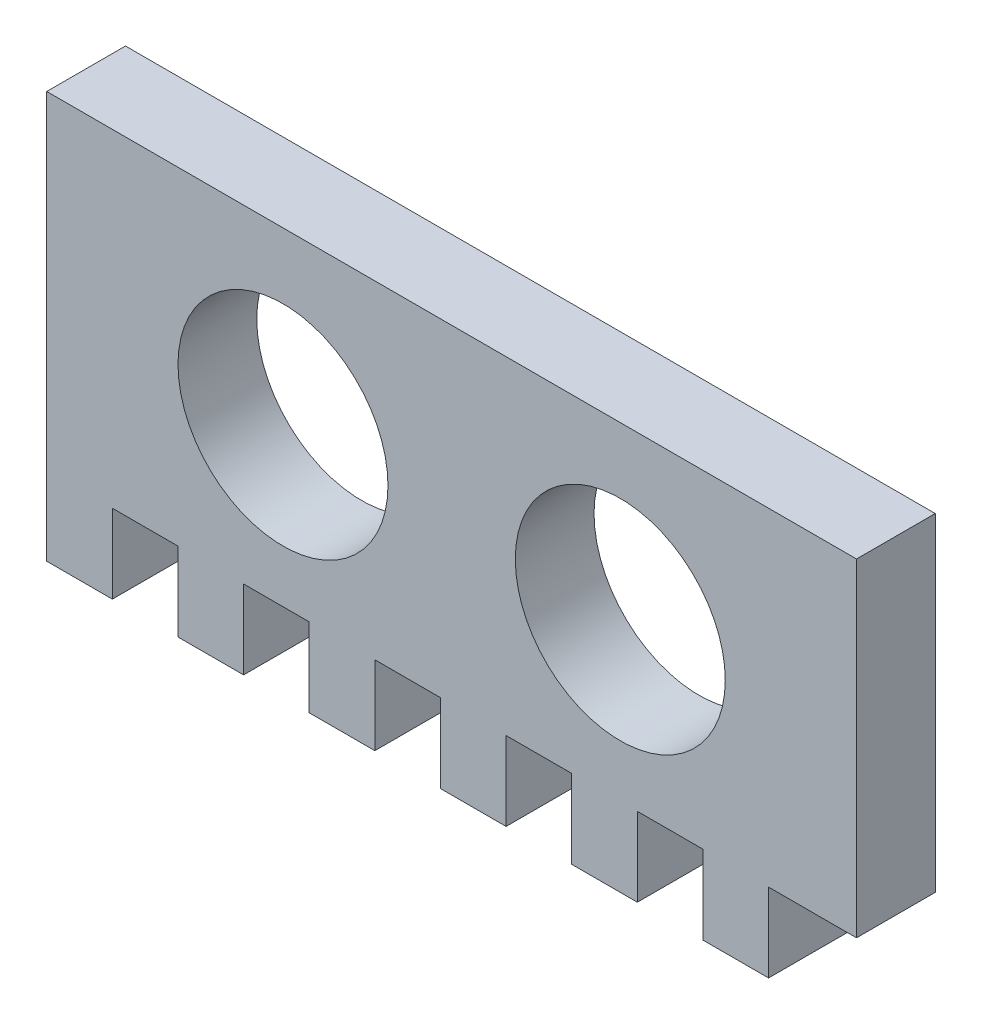
ISO-10303-21;
HEADER;
FILE_DESCRIPTION(('STEP AP214'),'2;1');
FILE_NAME('part.step','',(''),(''),'','','');
FILE_SCHEMA(('AUTOMOTIVE_DESIGN { 1 0 10303 214 1 1 1 1 }'));
ENDSEC;
DATA;
#1=APPLICATION_CONTEXT('core data for automotive mechanical design processes');
#2=APPLICATION_PROTOCOL_DEFINITION('international standard','automotive_design',2000,#1);
#3=PRODUCT_CONTEXT('',#1,'mechanical');
#4=PRODUCT('Part','Part','',(#3));
#5=PRODUCT_RELATED_PRODUCT_CATEGORY('part','',(#4));
#6=PRODUCT_DEFINITION_FORMATION('','',#4);
#7=PRODUCT_DEFINITION_CONTEXT('part definition',#1,'design');
#8=PRODUCT_DEFINITION('design','',#6,#7);
#9=PRODUCT_DEFINITION_SHAPE('','',#8);
#10=(LENGTH_UNIT() NAMED_UNIT(*) SI_UNIT(.MILLI.,.METRE.));
#11=(NAMED_UNIT(*) PLANE_ANGLE_UNIT() SI_UNIT($,.RADIAN.));
#12=(NAMED_UNIT(*) SI_UNIT($,.STERADIAN.) SOLID_ANGLE_UNIT());
#13=UNCERTAINTY_MEASURE_WITH_UNIT(LENGTH_MEASURE(1.E-05),#10,'distance_accuracy_value','');
#14=(GEOMETRIC_REPRESENTATION_CONTEXT(3) GLOBAL_UNCERTAINTY_ASSIGNED_CONTEXT((#13)) GLOBAL_UNIT_ASSIGNED_CONTEXT((#10,
#11,#12)) REPRESENTATION_CONTEXT('',''));
#15=CARTESIAN_POINT('',(0.,0.,0.));
#16=DIRECTION('',(0.,0.,1.));
#17=DIRECTION('',(1.,0.,0.));
#18=AXIS2_PLACEMENT_3D('',#15,#16,#17);
#19=CARTESIAN_POINT('',(0.,0.,6.));
#20=DIRECTION('',(0.,0.,1.));
#21=DIRECTION('',(1.,0.,0.));
#22=AXIS2_PLACEMENT_3D('',#19,#20,#21);
#23=PLANE('',#22);
#24=CARTESIAN_POINT('',(18.,18.,6.));
#25=DIRECTION('',(0.,0.,1.));
#26=DIRECTION('',(1.,0.,0.));
#27=AXIS2_PLACEMENT_3D('',#24,#25,#26);
#28=CIRCLE('',#27,8.);
#29=CARTESIAN_POINT('',(26.,18.,6.));
#30=VERTEX_POINT('',#29);
#31=EDGE_CURVE('E374',#30,#30,#28,.T.);
#32=ORIENTED_EDGE('',*,*,#31,.F.);
#33=EDGE_LOOP('',(#32));
#34=FACE_BOUND('',#33,.T.);
#35=DIRECTION('',(1.,0.,0.));
#36=VECTOR('',#35,1.);
#37=CARTESIAN_POINT('',(0.,0.,6.));
#38=LINE('',#37,#36);
#39=CARTESIAN_POINT('',(0.,0.,6.));
#40=VERTEX_POINT('',#39);
#41=CARTESIAN_POINT('',(5.,0.,6.));
#42=VERTEX_POINT('',#41);
#43=EDGE_CURVE('E367',#40,#42,#38,.T.);
#44=ORIENTED_EDGE('',*,*,#43,.T.);
#45=DIRECTION('',(0.,1.,0.));
#46=VECTOR('',#45,1.);
#47=CARTESIAN_POINT('',(5.,0.,6.));
#48=LINE('',#47,#46);
#49=CARTESIAN_POINT('',(5.,6.,6.));
#50=VERTEX_POINT('',#49);
#51=EDGE_CURVE('E161',#42,#50,#48,.T.);
#52=ORIENTED_EDGE('',*,*,#51,.T.);
#53=DIRECTION('',(1.,0.,0.));
#54=VECTOR('',#53,1.);
#55=CARTESIAN_POINT('',(5.,6.,6.));
#56=LINE('',#55,#54);
#57=CARTESIAN_POINT('',(10.,6.,6.));
#58=VERTEX_POINT('',#57);
#59=EDGE_CURVE('E361',#50,#58,#56,.T.);
#60=ORIENTED_EDGE('',*,*,#59,.T.);
#61=DIRECTION('',(0.,-1.,0.));
#62=VECTOR('',#61,1.);
#63=CARTESIAN_POINT('',(10.,6.,6.));
#64=LINE('',#63,#62);
#65=CARTESIAN_POINT('',(10.,0.,6.));
#66=VERTEX_POINT('',#65);
#67=EDGE_CURVE('E353',#58,#66,#64,.T.);
#68=ORIENTED_EDGE('',*,*,#67,.T.);
#69=DIRECTION('',(1.,0.,0.));
#70=VECTOR('',#69,1.);
#71=CARTESIAN_POINT('',(10.,0.,6.));
#72=LINE('',#71,#70);
#73=CARTESIAN_POINT('',(15.,0.,6.));
#74=VERTEX_POINT('',#73);
#75=EDGE_CURVE('E349',#66,#74,#72,.T.);
#76=ORIENTED_EDGE('',*,*,#75,.T.);
#77=DIRECTION('',(0.,1.,0.));
#78=VECTOR('',#77,1.);
#79=CARTESIAN_POINT('',(15.,0.,6.));
#80=LINE('',#79,#78);
#81=CARTESIAN_POINT('',(15.,6.,6.));
#82=VERTEX_POINT('',#81);
#83=EDGE_CURVE('E345',#74,#82,#80,.T.);
#84=ORIENTED_EDGE('',*,*,#83,.T.);
#85=DIRECTION('',(1.,0.,0.));
#86=VECTOR('',#85,1.);
#87=CARTESIAN_POINT('',(15.,6.,6.));
#88=LINE('',#87,#86);
#89=CARTESIAN_POINT('',(20.,6.,6.));
#90=VERTEX_POINT('',#89);
#91=EDGE_CURVE('E342',#82,#90,#88,.T.);
#92=ORIENTED_EDGE('',*,*,#91,.T.);
#93=DIRECTION('',(0.,-1.,0.));
#94=VECTOR('',#93,1.);
#95=CARTESIAN_POINT('',(20.,6.,6.));
#96=LINE('',#95,#94);
#97=CARTESIAN_POINT('',(20.,0.,6.));
#98=VERTEX_POINT('',#97);
#99=EDGE_CURVE('E334',#90,#98,#96,.T.);
#100=ORIENTED_EDGE('',*,*,#99,.T.);
#101=DIRECTION('',(1.,0.,0.));
#102=VECTOR('',#101,1.);
#103=CARTESIAN_POINT('',(20.,0.,6.));
#104=LINE('',#103,#102);
#105=CARTESIAN_POINT('',(25.,0.,6.));
#106=VERTEX_POINT('',#105);
#107=EDGE_CURVE('E330',#98,#106,#104,.T.);
#108=ORIENTED_EDGE('',*,*,#107,.T.);
#109=DIRECTION('',(0.,1.,0.));
#110=VECTOR('',#109,1.);
#111=CARTESIAN_POINT('',(25.,0.,6.));
#112=LINE('',#111,#110);
#113=CARTESIAN_POINT('',(25.,6.,6.));
#114=VERTEX_POINT('',#113);
#115=EDGE_CURVE('E326',#106,#114,#112,.T.);
#116=ORIENTED_EDGE('',*,*,#115,.T.);
#117=DIRECTION('',(1.,0.,0.));
#118=VECTOR('',#117,1.);
#119=CARTESIAN_POINT('',(25.,6.,6.));
#120=LINE('',#119,#118);
#121=CARTESIAN_POINT('',(30.,6.,6.));
#122=VERTEX_POINT('',#121);
#123=EDGE_CURVE('E323',#114,#122,#120,.T.);
#124=ORIENTED_EDGE('',*,*,#123,.T.);
#125=DIRECTION('',(0.,-1.,0.));
#126=VECTOR('',#125,1.);
#127=CARTESIAN_POINT('',(30.,6.,6.));
#128=LINE('',#127,#126);
#129=CARTESIAN_POINT('',(30.,0.,6.));
#130=VERTEX_POINT('',#129);
#131=EDGE_CURVE('E315',#122,#130,#128,.T.);
#132=ORIENTED_EDGE('',*,*,#131,.T.);
#133=DIRECTION('',(1.,0.,0.));
#134=VECTOR('',#133,1.);
#135=CARTESIAN_POINT('',(30.,0.,6.));
#136=LINE('',#135,#134);
#137=CARTESIAN_POINT('',(35.,0.,6.));
#138=VERTEX_POINT('',#137);
#139=EDGE_CURVE('E311',#130,#138,#136,.T.);
#140=ORIENTED_EDGE('',*,*,#139,.T.);
#141=DIRECTION('',(0.,1.,0.));
#142=VECTOR('',#141,1.);
#143=CARTESIAN_POINT('',(35.,0.,6.));
#144=LINE('',#143,#142);
#145=CARTESIAN_POINT('',(35.,6.,6.));
#146=VERTEX_POINT('',#145);
#147=EDGE_CURVE('E307',#138,#146,#144,.T.);
#148=ORIENTED_EDGE('',*,*,#147,.T.);
#149=DIRECTION('',(1.,0.,0.));
#150=VECTOR('',#149,1.);
#151=CARTESIAN_POINT('',(35.,6.,6.));
#152=LINE('',#151,#150);
#153=CARTESIAN_POINT('',(40.,6.,6.));
#154=VERTEX_POINT('',#153);
#155=EDGE_CURVE('E304',#146,#154,#152,.T.);
#156=ORIENTED_EDGE('',*,*,#155,.T.);
#157=DIRECTION('',(0.,-1.,0.));
#158=VECTOR('',#157,1.);
#159=CARTESIAN_POINT('',(40.,6.,6.));
#160=LINE('',#159,#158);
#161=CARTESIAN_POINT('',(40.,0.,6.));
#162=VERTEX_POINT('',#161);
#163=EDGE_CURVE('E296',#154,#162,#160,.T.);
#164=ORIENTED_EDGE('',*,*,#163,.T.);
#165=DIRECTION('',(1.,0.,0.));
#166=VECTOR('',#165,1.);
#167=CARTESIAN_POINT('',(40.,0.,6.));
#168=LINE('',#167,#166);
#169=CARTESIAN_POINT('',(45.,0.,6.));
#170=VERTEX_POINT('',#169);
#171=EDGE_CURVE('E292',#162,#170,#168,.T.);
#172=ORIENTED_EDGE('',*,*,#171,.T.);
#173=DIRECTION('',(0.,1.,0.));
#174=VECTOR('',#173,1.);
#175=CARTESIAN_POINT('',(45.,0.,6.));
#176=LINE('',#175,#174);
#177=CARTESIAN_POINT('',(45.,6.,6.));
#178=VERTEX_POINT('',#177);
#179=EDGE_CURVE('E288',#170,#178,#176,.T.);
#180=ORIENTED_EDGE('',*,*,#179,.T.);
#181=DIRECTION('',(1.,0.,0.));
#182=VECTOR('',#181,1.);
#183=CARTESIAN_POINT('',(45.,6.,6.));
#184=LINE('',#183,#182);
#185=CARTESIAN_POINT('',(50.,6.,6.));
#186=VERTEX_POINT('',#185);
#187=EDGE_CURVE('E285',#178,#186,#184,.T.);
#188=ORIENTED_EDGE('',*,*,#187,.T.);
#189=DIRECTION('',(0.,-1.,0.));
#190=VECTOR('',#189,1.);
#191=CARTESIAN_POINT('',(50.,6.,6.));
#192=LINE('',#191,#190);
#193=CARTESIAN_POINT('',(50.,0.,6.));
#194=VERTEX_POINT('',#193);
#195=EDGE_CURVE('E277',#186,#194,#192,.T.);
#196=ORIENTED_EDGE('',*,*,#195,.T.);
#197=DIRECTION('',(1.,0.,0.));
#198=VECTOR('',#197,1.);
#199=CARTESIAN_POINT('',(50.,0.,6.));
#200=LINE('',#199,#198);
#201=CARTESIAN_POINT('',(55.,0.,6.));
#202=VERTEX_POINT('',#201);
#203=EDGE_CURVE('E273',#194,#202,#200,.T.);
#204=ORIENTED_EDGE('',*,*,#203,.T.);
#205=DIRECTION('',(0.,1.,0.));
#206=VECTOR('',#205,1.);
#207=CARTESIAN_POINT('',(55.,0.,6.));
#208=LINE('',#207,#206);
#209=CARTESIAN_POINT('',(55.,6.,6.));
#210=VERTEX_POINT('',#209);
#211=EDGE_CURVE('E269',#202,#210,#208,.T.);
#212=ORIENTED_EDGE('',*,*,#211,.T.);
#213=DIRECTION('',(1.,0.,0.));
#214=VECTOR('',#213,1.);
#215=CARTESIAN_POINT('',(55.,6.,6.));
#216=LINE('',#215,#214);
#217=CARTESIAN_POINT('',(61.7,6.,6.));
#218=VERTEX_POINT('',#217);
#219=EDGE_CURVE('E234',#210,#218,#216,.T.);
#220=ORIENTED_EDGE('',*,*,#219,.T.);
#221=DIRECTION('',(0.,1.,0.));
#222=VECTOR('',#221,1.);
#223=CARTESIAN_POINT('',(61.7,31.,6.));
#224=LINE('',#223,#222);
#225=CARTESIAN_POINT('',(61.7,31.,6.));
#226=VERTEX_POINT('',#225);
#227=EDGE_CURVE('E228',#218,#226,#224,.T.);
#228=ORIENTED_EDGE('',*,*,#227,.T.);
#229=DIRECTION('',(-1.,0.,0.));
#230=VECTOR('',#229,1.);
#231=CARTESIAN_POINT('',(0.,31.,6.));
#232=LINE('',#231,#230);
#233=CARTESIAN_POINT('',(0.,31.,6.));
#234=VERTEX_POINT('',#233);
#235=EDGE_CURVE('E232',#226,#234,#232,.T.);
#236=ORIENTED_EDGE('',*,*,#235,.T.);
#237=DIRECTION('',(0.,-1.,0.));
#238=VECTOR('',#237,1.);
#239=CARTESIAN_POINT('',(0.,0.,6.));
#240=LINE('',#239,#238);
#241=EDGE_CURVE('E64',#234,#40,#240,.T.);
#242=ORIENTED_EDGE('',*,*,#241,.T.);
#243=EDGE_LOOP('',(#44,#52,#60,#68,#76,#84,#92,#100,#108,#116,#124,#132,#140,#148,#156,#164,
#172,#180,#188,#196,#204,#212,#220,#228,#236,#242));
#244=FACE_BOUND('',#243,.T.);
#245=CARTESIAN_POINT('',(43.7,18.,6.));
#246=DIRECTION('',(0.,0.,1.));
#247=DIRECTION('',(1.,0.,0.));
#248=AXIS2_PLACEMENT_3D('',#245,#246,#247);
#249=CIRCLE('',#248,8.);
#250=CARTESIAN_POINT('',(51.7,18.,6.));
#251=VERTEX_POINT('',#250);
#252=EDGE_CURVE('E383',#251,#251,#249,.T.);
#253=ORIENTED_EDGE('',*,*,#252,.F.);
#254=EDGE_LOOP('',(#253));
#255=FACE_BOUND('',#254,.T.);
#256=ADVANCED_FACE('F46',(#34,#244,#255),#23,.T.);
#257=CARTESIAN_POINT('',(0.,0.,0.));
#258=DIRECTION('',(0.,0.,1.));
#259=DIRECTION('',(1.,0.,0.));
#260=AXIS2_PLACEMENT_3D('',#257,#258,#259);
#261=PLANE('',#260);
#262=DIRECTION('',(1.,0.,0.));
#263=VECTOR('',#262,1.);
#264=CARTESIAN_POINT('',(0.,0.,0.));
#265=LINE('',#264,#263);
#266=CARTESIAN_POINT('',(0.,0.,0.));
#267=VERTEX_POINT('',#266);
#268=CARTESIAN_POINT('',(5.,0.,0.));
#269=VERTEX_POINT('',#268);
#270=EDGE_CURVE('E379',#267,#269,#265,.T.);
#271=ORIENTED_EDGE('',*,*,#270,.F.);
#272=DIRECTION('',(0.,-1.,0.));
#273=VECTOR('',#272,1.);
#274=CARTESIAN_POINT('',(0.,0.,0.));
#275=LINE('',#274,#273);
#276=CARTESIAN_POINT('',(0.,31.,0.));
#277=VERTEX_POINT('',#276);
#278=EDGE_CURVE('E153',#277,#267,#275,.T.);
#279=ORIENTED_EDGE('',*,*,#278,.F.);
#280=DIRECTION('',(-1.,0.,0.));
#281=VECTOR('',#280,1.);
#282=CARTESIAN_POINT('',(0.,31.,0.));
#283=LINE('',#282,#281);
#284=CARTESIAN_POINT('',(61.7,31.,0.));
#285=VERTEX_POINT('',#284);
#286=EDGE_CURVE('E147',#285,#277,#283,.T.);
#287=ORIENTED_EDGE('',*,*,#286,.F.);
#288=DIRECTION('',(0.,1.,0.));
#289=VECTOR('',#288,1.);
#290=CARTESIAN_POINT('',(61.7,31.,0.));
#291=LINE('',#290,#289);
#292=CARTESIAN_POINT('',(61.7,6.,0.));
#293=VERTEX_POINT('',#292);
#294=EDGE_CURVE('E243',#293,#285,#291,.T.);
#295=ORIENTED_EDGE('',*,*,#294,.F.);
#296=DIRECTION('',(1.,0.,0.));
#297=VECTOR('',#296,1.);
#298=CARTESIAN_POINT('',(55.,6.,0.));
#299=LINE('',#298,#297);
#300=CARTESIAN_POINT('',(55.,6.,0.));
#301=VERTEX_POINT('',#300);
#302=EDGE_CURVE('E587',#301,#293,#299,.T.);
#303=ORIENTED_EDGE('',*,*,#302,.F.);
#304=DIRECTION('',(0.,1.,0.));
#305=VECTOR('',#304,1.);
#306=CARTESIAN_POINT('',(55.,0.,0.));
#307=LINE('',#306,#305);
#308=CARTESIAN_POINT('',(55.,0.,0.));
#309=VERTEX_POINT('',#308);
#310=EDGE_CURVE('E584',#309,#301,#307,.T.);
#311=ORIENTED_EDGE('',*,*,#310,.F.);
#312=DIRECTION('',(1.,0.,0.));
#313=VECTOR('',#312,1.);
#314=CARTESIAN_POINT('',(50.,0.,0.));
#315=LINE('',#314,#313);
#316=CARTESIAN_POINT('',(50.,0.,0.));
#317=VERTEX_POINT('',#316);
#318=EDGE_CURVE('E582',#317,#309,#315,.T.);
#319=ORIENTED_EDGE('',*,*,#318,.F.);
#320=DIRECTION('',(0.,-1.,0.));
#321=VECTOR('',#320,1.);
#322=CARTESIAN_POINT('',(50.,6.,0.));
#323=LINE('',#322,#321);
#324=CARTESIAN_POINT('',(50.,6.,0.));
#325=VERTEX_POINT('',#324);
#326=EDGE_CURVE('E579',#325,#317,#323,.T.);
#327=ORIENTED_EDGE('',*,*,#326,.F.);
#328=DIRECTION('',(1.,0.,0.));
#329=VECTOR('',#328,1.);
#330=CARTESIAN_POINT('',(45.,6.,0.));
#331=LINE('',#330,#329);
#332=CARTESIAN_POINT('',(45.,6.,0.));
#333=VERTEX_POINT('',#332);
#334=EDGE_CURVE('E576',#333,#325,#331,.T.);
#335=ORIENTED_EDGE('',*,*,#334,.F.);
#336=DIRECTION('',(0.,1.,0.));
#337=VECTOR('',#336,1.);
#338=CARTESIAN_POINT('',(45.,0.,0.));
#339=LINE('',#338,#337);
#340=CARTESIAN_POINT('',(45.,0.,0.));
#341=VERTEX_POINT('',#340);
#342=EDGE_CURVE('E573',#341,#333,#339,.T.);
#343=ORIENTED_EDGE('',*,*,#342,.F.);
#344=DIRECTION('',(1.,0.,0.));
#345=VECTOR('',#344,1.);
#346=CARTESIAN_POINT('',(40.,0.,0.));
#347=LINE('',#346,#345);
#348=CARTESIAN_POINT('',(40.,0.,0.));
#349=VERTEX_POINT('',#348);
#350=EDGE_CURVE('E570',#349,#341,#347,.T.);
#351=ORIENTED_EDGE('',*,*,#350,.F.);
#352=DIRECTION('',(0.,-1.,0.));
#353=VECTOR('',#352,1.);
#354=CARTESIAN_POINT('',(40.,6.,0.));
#355=LINE('',#354,#353);
#356=CARTESIAN_POINT('',(40.,6.,0.));
#357=VERTEX_POINT('',#356);
#358=EDGE_CURVE('E568',#357,#349,#355,.T.);
#359=ORIENTED_EDGE('',*,*,#358,.F.);
#360=DIRECTION('',(1.,0.,0.));
#361=VECTOR('',#360,1.);
#362=CARTESIAN_POINT('',(35.,6.,0.));
#363=LINE('',#362,#361);
#364=CARTESIAN_POINT('',(35.,6.,0.));
#365=VERTEX_POINT('',#364);
#366=EDGE_CURVE('E566',#365,#357,#363,.T.);
#367=ORIENTED_EDGE('',*,*,#366,.F.);
#368=DIRECTION('',(0.,1.,0.));
#369=VECTOR('',#368,1.);
#370=CARTESIAN_POINT('',(35.,0.,0.));
#371=LINE('',#370,#369);
#372=CARTESIAN_POINT('',(35.,0.,0.));
#373=VERTEX_POINT('',#372);
#374=EDGE_CURVE('E563',#373,#365,#371,.T.);
#375=ORIENTED_EDGE('',*,*,#374,.F.);
#376=DIRECTION('',(1.,0.,0.));
#377=VECTOR('',#376,1.);
#378=CARTESIAN_POINT('',(30.,0.,0.));
#379=LINE('',#378,#377);
#380=CARTESIAN_POINT('',(30.,0.,0.));
#381=VERTEX_POINT('',#380);
#382=EDGE_CURVE('E560',#381,#373,#379,.T.);
#383=ORIENTED_EDGE('',*,*,#382,.F.);
#384=DIRECTION('',(0.,-1.,0.));
#385=VECTOR('',#384,1.);
#386=CARTESIAN_POINT('',(30.,6.,0.));
#387=LINE('',#386,#385);
#388=CARTESIAN_POINT('',(30.,6.,0.));
#389=VERTEX_POINT('',#388);
#390=EDGE_CURVE('E557',#389,#381,#387,.T.);
#391=ORIENTED_EDGE('',*,*,#390,.F.);
#392=DIRECTION('',(1.,0.,0.));
#393=VECTOR('',#392,1.);
#394=CARTESIAN_POINT('',(25.,6.,0.));
#395=LINE('',#394,#393);
#396=CARTESIAN_POINT('',(25.,6.,0.));
#397=VERTEX_POINT('',#396);
#398=EDGE_CURVE('E554',#397,#389,#395,.T.);
#399=ORIENTED_EDGE('',*,*,#398,.F.);
#400=DIRECTION('',(0.,1.,0.));
#401=VECTOR('',#400,1.);
#402=CARTESIAN_POINT('',(25.,0.,0.));
#403=LINE('',#402,#401);
#404=CARTESIAN_POINT('',(25.,0.,0.));
#405=VERTEX_POINT('',#404);
#406=EDGE_CURVE('E551',#405,#397,#403,.T.);
#407=ORIENTED_EDGE('',*,*,#406,.F.);
#408=DIRECTION('',(1.,0.,0.));
#409=VECTOR('',#408,1.);
#410=CARTESIAN_POINT('',(20.,0.,0.));
#411=LINE('',#410,#409);
#412=CARTESIAN_POINT('',(20.,0.,0.));
#413=VERTEX_POINT('',#412);
#414=EDGE_CURVE('E548',#413,#405,#411,.T.);
#415=ORIENTED_EDGE('',*,*,#414,.F.);
#416=DIRECTION('',(0.,-1.,0.));
#417=VECTOR('',#416,1.);
#418=CARTESIAN_POINT('',(20.,6.,0.));
#419=LINE('',#418,#417);
#420=CARTESIAN_POINT('',(20.,6.,0.));
#421=VERTEX_POINT('',#420);
#422=EDGE_CURVE('E545',#421,#413,#419,.T.);
#423=ORIENTED_EDGE('',*,*,#422,.F.);
#424=DIRECTION('',(1.,0.,0.));
#425=VECTOR('',#424,1.);
#426=CARTESIAN_POINT('',(15.,6.,0.));
#427=LINE('',#426,#425);
#428=CARTESIAN_POINT('',(15.,6.,0.));
#429=VERTEX_POINT('',#428);
#430=EDGE_CURVE('E542',#429,#421,#427,.T.);
#431=ORIENTED_EDGE('',*,*,#430,.F.);
#432=DIRECTION('',(0.,1.,0.));
#433=VECTOR('',#432,1.);
#434=CARTESIAN_POINT('',(15.,0.,0.));
#435=LINE('',#434,#433);
#436=CARTESIAN_POINT('',(15.,0.,0.));
#437=VERTEX_POINT('',#436);
#438=EDGE_CURVE('E539',#437,#429,#435,.T.);
#439=ORIENTED_EDGE('',*,*,#438,.F.);
#440=DIRECTION('',(1.,0.,0.));
#441=VECTOR('',#440,1.);
#442=CARTESIAN_POINT('',(10.,0.,0.));
#443=LINE('',#442,#441);
#444=CARTESIAN_POINT('',(10.,0.,0.));
#445=VERTEX_POINT('',#444);
#446=EDGE_CURVE('E534',#445,#437,#443,.T.);
#447=ORIENTED_EDGE('',*,*,#446,.F.);
#448=DIRECTION('',(0.,-1.,0.));
#449=VECTOR('',#448,1.);
#450=CARTESIAN_POINT('',(10.,6.,0.));
#451=LINE('',#450,#449);
#452=CARTESIAN_POINT('',(10.,6.,0.));
#453=VERTEX_POINT('',#452);
#454=EDGE_CURVE('E528',#453,#445,#451,.T.);
#455=ORIENTED_EDGE('',*,*,#454,.F.);
#456=DIRECTION('',(1.,0.,0.));
#457=VECTOR('',#456,1.);
#458=CARTESIAN_POINT('',(5.,6.,0.));
#459=LINE('',#458,#457);
#460=CARTESIAN_POINT('',(5.,6.,0.));
#461=VERTEX_POINT('',#460);
#462=EDGE_CURVE('E520',#461,#453,#459,.T.);
#463=ORIENTED_EDGE('',*,*,#462,.F.);
#464=DIRECTION('',(0.,1.,0.));
#465=VECTOR('',#464,1.);
#466=CARTESIAN_POINT('',(5.,0.,0.));
#467=LINE('',#466,#465);
#468=EDGE_CURVE('E512',#269,#461,#467,.T.);
#469=ORIENTED_EDGE('',*,*,#468,.F.);
#470=EDGE_LOOP('',(#271,#279,#287,#295,#303,#311,#319,#327,#335,#343,#351,#359,#367,#375,#383,
#391,#399,#407,#415,#423,#431,#439,#447,#455,#463,#469));
#471=FACE_BOUND('',#470,.T.);
#472=CARTESIAN_POINT('',(18.,18.,0.));
#473=DIRECTION('',(0.,0.,1.));
#474=DIRECTION('',(1.,0.,0.));
#475=AXIS2_PLACEMENT_3D('',#472,#473,#474);
#476=CIRCLE('',#475,8.);
#477=CARTESIAN_POINT('',(26.,18.,0.));
#478=VERTEX_POINT('',#477);
#479=EDGE_CURVE('E371',#478,#478,#476,.T.);
#480=ORIENTED_EDGE('',*,*,#479,.T.);
#481=EDGE_LOOP('',(#480));
#482=FACE_BOUND('',#481,.T.);
#483=CARTESIAN_POINT('',(43.7,18.,0.));
#484=DIRECTION('',(0.,0.,1.));
#485=DIRECTION('',(1.,0.,0.));
#486=AXIS2_PLACEMENT_3D('',#483,#484,#485);
#487=CIRCLE('',#486,8.);
#488=CARTESIAN_POINT('',(51.7,18.,0.));
#489=VERTEX_POINT('',#488);
#490=EDGE_CURVE('E380',#489,#489,#487,.T.);
#491=ORIENTED_EDGE('',*,*,#490,.T.);
#492=EDGE_LOOP('',(#491));
#493=FACE_BOUND('',#492,.T.);
#494=ADVANCED_FACE('F397',(#471,#482,#493),#261,.F.);
#495=CARTESIAN_POINT('',(0.,0.,6.));
#496=DIRECTION('',(0.,1.,0.));
#497=DIRECTION('',(0.,0.,1.));
#498=AXIS2_PLACEMENT_3D('',#495,#496,#497);
#499=PLANE('',#498);
#500=ORIENTED_EDGE('',*,*,#270,.T.);
#501=DIRECTION('',(0.,0.,-1.));
#502=VECTOR('',#501,1.);
#503=CARTESIAN_POINT('',(5.,0.,6.));
#504=LINE('',#503,#502);
#505=EDGE_CURVE('E12',#42,#269,#504,.T.);
#506=ORIENTED_EDGE('',*,*,#505,.F.);
#507=ORIENTED_EDGE('',*,*,#43,.F.);
#508=DIRECTION('',(0.,0.,-1.));
#509=VECTOR('',#508,1.);
#510=CARTESIAN_POINT('',(0.,0.,6.));
#511=LINE('',#510,#509);
#512=EDGE_CURVE('E254',#40,#267,#511,.T.);
#513=ORIENTED_EDGE('',*,*,#512,.T.);
#514=EDGE_LOOP('',(#500,#506,#507,#513));
#515=FACE_BOUND('',#514,.T.);
#516=ADVANCED_FACE('F48',(#515),#499,.F.);
#517=CARTESIAN_POINT('',(5.,0.,6.));
#518=DIRECTION('',(-1.,0.,0.));
#519=DIRECTION('',(0.,0.,1.));
#520=AXIS2_PLACEMENT_3D('',#517,#518,#519);
#521=PLANE('',#520);
#522=ORIENTED_EDGE('',*,*,#468,.T.);
#523=DIRECTION('',(0.,0.,-1.));
#524=VECTOR('',#523,1.);
#525=CARTESIAN_POINT('',(5.,6.,6.));
#526=LINE('',#525,#524);
#527=EDGE_CURVE('E56',#50,#461,#526,.T.);
#528=ORIENTED_EDGE('',*,*,#527,.F.);
#529=ORIENTED_EDGE('',*,*,#51,.F.);
#530=ORIENTED_EDGE('',*,*,#505,.T.);
#531=EDGE_LOOP('',(#522,#528,#529,#530));
#532=FACE_BOUND('',#531,.T.);
#533=ADVANCED_FACE('F506',(#532),#521,.F.);
#534=CARTESIAN_POINT('',(5.,6.,6.));
#535=DIRECTION('',(0.,1.,0.));
#536=DIRECTION('',(0.,0.,1.));
#537=AXIS2_PLACEMENT_3D('',#534,#535,#536);
#538=PLANE('',#537);
#539=ORIENTED_EDGE('',*,*,#462,.T.);
#540=DIRECTION('',(0.,0.,-1.));
#541=VECTOR('',#540,1.);
#542=CARTESIAN_POINT('',(10.,6.,6.));
#543=LINE('',#542,#541);
#544=EDGE_CURVE('E525',#58,#453,#543,.T.);
#545=ORIENTED_EDGE('',*,*,#544,.F.);
#546=ORIENTED_EDGE('',*,*,#59,.F.);
#547=ORIENTED_EDGE('',*,*,#527,.T.);
#548=EDGE_LOOP('',(#539,#545,#546,#547));
#549=FACE_BOUND('',#548,.T.);
#550=ADVANCED_FACE('F503',(#549),#538,.F.);
#551=CARTESIAN_POINT('',(10.,6.,6.));
#552=DIRECTION('',(1.,0.,0.));
#553=DIRECTION('',(0.,0.,-1.));
#554=AXIS2_PLACEMENT_3D('',#551,#552,#553);
#555=PLANE('',#554);
#556=ORIENTED_EDGE('',*,*,#454,.T.);
#557=DIRECTION('',(0.,0.,-1.));
#558=VECTOR('',#557,1.);
#559=CARTESIAN_POINT('',(10.,0.,6.));
#560=LINE('',#559,#558);
#561=EDGE_CURVE('E670',#66,#445,#560,.T.);
#562=ORIENTED_EDGE('',*,*,#561,.F.);
#563=ORIENTED_EDGE('',*,*,#67,.F.);
#564=ORIENTED_EDGE('',*,*,#544,.T.);
#565=EDGE_LOOP('',(#556,#562,#563,#564));
#566=FACE_BOUND('',#565,.T.);
#567=ADVANCED_FACE('F499',(#566),#555,.F.);
#568=CARTESIAN_POINT('',(10.,0.,6.));
#569=DIRECTION('',(0.,1.,0.));
#570=DIRECTION('',(0.,0.,1.));
#571=AXIS2_PLACEMENT_3D('',#568,#569,#570);
#572=PLANE('',#571);
#573=ORIENTED_EDGE('',*,*,#446,.T.);
#574=DIRECTION('',(0.,0.,-1.));
#575=VECTOR('',#574,1.);
#576=CARTESIAN_POINT('',(15.,0.,6.));
#577=LINE('',#576,#575);
#578=EDGE_CURVE('E666',#74,#437,#577,.T.);
#579=ORIENTED_EDGE('',*,*,#578,.F.);
#580=ORIENTED_EDGE('',*,*,#75,.F.);
#581=ORIENTED_EDGE('',*,*,#561,.T.);
#582=EDGE_LOOP('',(#573,#579,#580,#581));
#583=FACE_BOUND('',#582,.T.);
#584=ADVANCED_FACE('F495',(#583),#572,.F.);
#585=CARTESIAN_POINT('',(15.,0.,6.));
#586=DIRECTION('',(-1.,0.,0.));
#587=DIRECTION('',(0.,0.,1.));
#588=AXIS2_PLACEMENT_3D('',#585,#586,#587);
#589=PLANE('',#588);
#590=ORIENTED_EDGE('',*,*,#438,.T.);
#591=DIRECTION('',(0.,0.,-1.));
#592=VECTOR('',#591,1.);
#593=CARTESIAN_POINT('',(15.,6.,6.));
#594=LINE('',#593,#592);
#595=EDGE_CURVE('E662',#82,#429,#594,.T.);
#596=ORIENTED_EDGE('',*,*,#595,.F.);
#597=ORIENTED_EDGE('',*,*,#83,.F.);
#598=ORIENTED_EDGE('',*,*,#578,.T.);
#599=EDGE_LOOP('',(#590,#596,#597,#598));
#600=FACE_BOUND('',#599,.T.);
#601=ADVANCED_FACE('F491',(#600),#589,.F.);
#602=CARTESIAN_POINT('',(15.,6.,6.));
#603=DIRECTION('',(0.,1.,0.));
#604=DIRECTION('',(-1.,0.,0.));
#605=AXIS2_PLACEMENT_3D('',#602,#603,#604);
#606=PLANE('',#605);
#607=ORIENTED_EDGE('',*,*,#430,.T.);
#608=DIRECTION('',(0.,0.,-1.));
#609=VECTOR('',#608,1.);
#610=CARTESIAN_POINT('',(20.,6.,6.));
#611=LINE('',#610,#609);
#612=EDGE_CURVE('E658',#90,#421,#611,.T.);
#613=ORIENTED_EDGE('',*,*,#612,.F.);
#614=ORIENTED_EDGE('',*,*,#91,.F.);
#615=ORIENTED_EDGE('',*,*,#595,.T.);
#616=EDGE_LOOP('',(#607,#613,#614,#615));
#617=FACE_BOUND('',#616,.T.);
#618=ADVANCED_FACE('F487',(#617),#606,.F.);
#619=CARTESIAN_POINT('',(20.,6.,6.));
#620=DIRECTION('',(1.,0.,0.));
#621=DIRECTION('',(0.,0.,-1.));
#622=AXIS2_PLACEMENT_3D('',#619,#620,#621);
#623=PLANE('',#622);
#624=ORIENTED_EDGE('',*,*,#422,.T.);
#625=DIRECTION('',(0.,0.,-1.));
#626=VECTOR('',#625,1.);
#627=CARTESIAN_POINT('',(20.,0.,6.));
#628=LINE('',#627,#626);
#629=EDGE_CURVE('E654',#98,#413,#628,.T.);
#630=ORIENTED_EDGE('',*,*,#629,.F.);
#631=ORIENTED_EDGE('',*,*,#99,.F.);
#632=ORIENTED_EDGE('',*,*,#612,.T.);
#633=EDGE_LOOP('',(#624,#630,#631,#632));
#634=FACE_BOUND('',#633,.T.);
#635=ADVANCED_FACE('F483',(#634),#623,.F.);
#636=CARTESIAN_POINT('',(20.,0.,6.));
#637=DIRECTION('',(0.,1.,0.));
#638=DIRECTION('',(-1.,0.,0.));
#639=AXIS2_PLACEMENT_3D('',#636,#637,#638);
#640=PLANE('',#639);
#641=ORIENTED_EDGE('',*,*,#414,.T.);
#642=DIRECTION('',(0.,0.,-1.));
#643=VECTOR('',#642,1.);
#644=CARTESIAN_POINT('',(25.,0.,6.));
#645=LINE('',#644,#643);
#646=EDGE_CURVE('E651',#106,#405,#645,.T.);
#647=ORIENTED_EDGE('',*,*,#646,.F.);
#648=ORIENTED_EDGE('',*,*,#107,.F.);
#649=ORIENTED_EDGE('',*,*,#629,.T.);
#650=EDGE_LOOP('',(#641,#647,#648,#649));
#651=FACE_BOUND('',#650,.T.);
#652=ADVANCED_FACE('F479',(#651),#640,.F.);
#653=CARTESIAN_POINT('',(25.,0.,6.));
#654=DIRECTION('',(-1.,0.,0.));
#655=DIRECTION('',(0.,0.,1.));
#656=AXIS2_PLACEMENT_3D('',#653,#654,#655);
#657=PLANE('',#656);
#658=ORIENTED_EDGE('',*,*,#406,.T.);
#659=DIRECTION('',(0.,0.,-1.));
#660=VECTOR('',#659,1.);
#661=CARTESIAN_POINT('',(25.,6.,6.));
#662=LINE('',#661,#660);
#663=EDGE_CURVE('E647',#114,#397,#662,.T.);
#664=ORIENTED_EDGE('',*,*,#663,.F.);
#665=ORIENTED_EDGE('',*,*,#115,.F.);
#666=ORIENTED_EDGE('',*,*,#646,.T.);
#667=EDGE_LOOP('',(#658,#664,#665,#666));
#668=FACE_BOUND('',#667,.T.);
#669=ADVANCED_FACE('F475',(#668),#657,.F.);
#670=CARTESIAN_POINT('',(25.,6.,6.));
#671=DIRECTION('',(0.,1.,0.));
#672=DIRECTION('',(0.,0.,1.));
#673=AXIS2_PLACEMENT_3D('',#670,#671,#672);
#674=PLANE('',#673);
#675=ORIENTED_EDGE('',*,*,#398,.T.);
#676=DIRECTION('',(0.,0.,-1.));
#677=VECTOR('',#676,1.);
#678=CARTESIAN_POINT('',(30.,6.,6.));
#679=LINE('',#678,#677);
#680=EDGE_CURVE('E643',#122,#389,#679,.T.);
#681=ORIENTED_EDGE('',*,*,#680,.F.);
#682=ORIENTED_EDGE('',*,*,#123,.F.);
#683=ORIENTED_EDGE('',*,*,#663,.T.);
#684=EDGE_LOOP('',(#675,#681,#682,#683));
#685=FACE_BOUND('',#684,.T.);
#686=ADVANCED_FACE('F471',(#685),#674,.F.);
#687=CARTESIAN_POINT('',(30.,6.,6.));
#688=DIRECTION('',(1.,0.,0.));
#689=DIRECTION('',(0.,0.,-1.));
#690=AXIS2_PLACEMENT_3D('',#687,#688,#689);
#691=PLANE('',#690);
#692=ORIENTED_EDGE('',*,*,#390,.T.);
#693=DIRECTION('',(0.,0.,-1.));
#694=VECTOR('',#693,1.);
#695=CARTESIAN_POINT('',(30.,0.,6.));
#696=LINE('',#695,#694);
#697=EDGE_CURVE('E639',#130,#381,#696,.T.);
#698=ORIENTED_EDGE('',*,*,#697,.F.);
#699=ORIENTED_EDGE('',*,*,#131,.F.);
#700=ORIENTED_EDGE('',*,*,#680,.T.);
#701=EDGE_LOOP('',(#692,#698,#699,#700));
#702=FACE_BOUND('',#701,.T.);
#703=ADVANCED_FACE('F467',(#702),#691,.F.);
#704=CARTESIAN_POINT('',(30.,0.,6.));
#705=DIRECTION('',(0.,1.,0.));
#706=DIRECTION('',(-1.,0.,0.));
#707=AXIS2_PLACEMENT_3D('',#704,#705,#706);
#708=PLANE('',#707);
#709=ORIENTED_EDGE('',*,*,#382,.T.);
#710=DIRECTION('',(0.,0.,-1.));
#711=VECTOR('',#710,1.);
#712=CARTESIAN_POINT('',(35.,0.,6.));
#713=LINE('',#712,#711);
#714=EDGE_CURVE('E635',#138,#373,#713,.T.);
#715=ORIENTED_EDGE('',*,*,#714,.F.);
#716=ORIENTED_EDGE('',*,*,#139,.F.);
#717=ORIENTED_EDGE('',*,*,#697,.T.);
#718=EDGE_LOOP('',(#709,#715,#716,#717));
#719=FACE_BOUND('',#718,.T.);
#720=ADVANCED_FACE('F463',(#719),#708,.F.);
#721=CARTESIAN_POINT('',(35.,0.,6.));
#722=DIRECTION('',(-1.,0.,0.));
#723=DIRECTION('',(0.,0.,1.));
#724=AXIS2_PLACEMENT_3D('',#721,#722,#723);
#725=PLANE('',#724);
#726=ORIENTED_EDGE('',*,*,#374,.T.);
#727=DIRECTION('',(0.,0.,-1.));
#728=VECTOR('',#727,1.);
#729=CARTESIAN_POINT('',(35.,6.,6.));
#730=LINE('',#729,#728);
#731=EDGE_CURVE('E631',#146,#365,#730,.T.);
#732=ORIENTED_EDGE('',*,*,#731,.F.);
#733=ORIENTED_EDGE('',*,*,#147,.F.);
#734=ORIENTED_EDGE('',*,*,#714,.T.);
#735=EDGE_LOOP('',(#726,#732,#733,#734));
#736=FACE_BOUND('',#735,.T.);
#737=ADVANCED_FACE('F459',(#736),#725,.F.);
#738=CARTESIAN_POINT('',(35.,6.,6.));
#739=DIRECTION('',(0.,1.,0.));
#740=DIRECTION('',(0.,0.,1.));
#741=AXIS2_PLACEMENT_3D('',#738,#739,#740);
#742=PLANE('',#741);
#743=ORIENTED_EDGE('',*,*,#366,.T.);
#744=DIRECTION('',(0.,0.,-1.));
#745=VECTOR('',#744,1.);
#746=CARTESIAN_POINT('',(40.,6.,6.));
#747=LINE('',#746,#745);
#748=EDGE_CURVE('E627',#154,#357,#747,.T.);
#749=ORIENTED_EDGE('',*,*,#748,.F.);
#750=ORIENTED_EDGE('',*,*,#155,.F.);
#751=ORIENTED_EDGE('',*,*,#731,.T.);
#752=EDGE_LOOP('',(#743,#749,#750,#751));
#753=FACE_BOUND('',#752,.T.);
#754=ADVANCED_FACE('F455',(#753),#742,.F.);
#755=CARTESIAN_POINT('',(40.,6.,6.));
#756=DIRECTION('',(1.,0.,0.));
#757=DIRECTION('',(0.,0.,-1.));
#758=AXIS2_PLACEMENT_3D('',#755,#756,#757);
#759=PLANE('',#758);
#760=ORIENTED_EDGE('',*,*,#358,.T.);
#761=DIRECTION('',(0.,0.,-1.));
#762=VECTOR('',#761,1.);
#763=CARTESIAN_POINT('',(40.,0.,6.));
#764=LINE('',#763,#762);
#765=EDGE_CURVE('E623',#162,#349,#764,.T.);
#766=ORIENTED_EDGE('',*,*,#765,.F.);
#767=ORIENTED_EDGE('',*,*,#163,.F.);
#768=ORIENTED_EDGE('',*,*,#748,.T.);
#769=EDGE_LOOP('',(#760,#766,#767,#768));
#770=FACE_BOUND('',#769,.T.);
#771=ADVANCED_FACE('F451',(#770),#759,.F.);
#772=CARTESIAN_POINT('',(40.,0.,6.));
#773=DIRECTION('',(0.,1.,0.));
#774=DIRECTION('',(0.,0.,1.));
#775=AXIS2_PLACEMENT_3D('',#772,#773,#774);
#776=PLANE('',#775);
#777=ORIENTED_EDGE('',*,*,#350,.T.);
#778=DIRECTION('',(0.,0.,-1.));
#779=VECTOR('',#778,1.);
#780=CARTESIAN_POINT('',(45.,0.,6.));
#781=LINE('',#780,#779);
#782=EDGE_CURVE('E619',#170,#341,#781,.T.);
#783=ORIENTED_EDGE('',*,*,#782,.F.);
#784=ORIENTED_EDGE('',*,*,#171,.F.);
#785=ORIENTED_EDGE('',*,*,#765,.T.);
#786=EDGE_LOOP('',(#777,#783,#784,#785));
#787=FACE_BOUND('',#786,.T.);
#788=ADVANCED_FACE('F447',(#787),#776,.F.);
#789=CARTESIAN_POINT('',(45.,0.,6.));
#790=DIRECTION('',(-1.,0.,0.));
#791=DIRECTION('',(0.,0.,1.));
#792=AXIS2_PLACEMENT_3D('',#789,#790,#791);
#793=PLANE('',#792);
#794=ORIENTED_EDGE('',*,*,#342,.T.);
#795=DIRECTION('',(0.,0.,-1.));
#796=VECTOR('',#795,1.);
#797=CARTESIAN_POINT('',(45.,6.,6.));
#798=LINE('',#797,#796);
#799=EDGE_CURVE('E616',#178,#333,#798,.T.);
#800=ORIENTED_EDGE('',*,*,#799,.F.);
#801=ORIENTED_EDGE('',*,*,#179,.F.);
#802=ORIENTED_EDGE('',*,*,#782,.T.);
#803=EDGE_LOOP('',(#794,#800,#801,#802));
#804=FACE_BOUND('',#803,.T.);
#805=ADVANCED_FACE('F443',(#804),#793,.F.);
#806=CARTESIAN_POINT('',(45.,6.,6.));
#807=DIRECTION('',(0.,1.,0.));
#808=DIRECTION('',(0.,0.,1.));
#809=AXIS2_PLACEMENT_3D('',#806,#807,#808);
#810=PLANE('',#809);
#811=ORIENTED_EDGE('',*,*,#334,.T.);
#812=DIRECTION('',(0.,0.,-1.));
#813=VECTOR('',#812,1.);
#814=CARTESIAN_POINT('',(50.,6.,6.));
#815=LINE('',#814,#813);
#816=EDGE_CURVE('E613',#186,#325,#815,.T.);
#817=ORIENTED_EDGE('',*,*,#816,.F.);
#818=ORIENTED_EDGE('',*,*,#187,.F.);
#819=ORIENTED_EDGE('',*,*,#799,.T.);
#820=EDGE_LOOP('',(#811,#817,#818,#819));
#821=FACE_BOUND('',#820,.T.);
#822=ADVANCED_FACE('F439',(#821),#810,.F.);
#823=CARTESIAN_POINT('',(50.,6.,6.));
#824=DIRECTION('',(1.,0.,0.));
#825=DIRECTION('',(0.,0.,-1.));
#826=AXIS2_PLACEMENT_3D('',#823,#824,#825);
#827=PLANE('',#826);
#828=ORIENTED_EDGE('',*,*,#326,.T.);
#829=DIRECTION('',(0.,0.,-1.));
#830=VECTOR('',#829,1.);
#831=CARTESIAN_POINT('',(50.,0.,6.));
#832=LINE('',#831,#830);
#833=EDGE_CURVE('E609',#194,#317,#832,.T.);
#834=ORIENTED_EDGE('',*,*,#833,.F.);
#835=ORIENTED_EDGE('',*,*,#195,.F.);
#836=ORIENTED_EDGE('',*,*,#816,.T.);
#837=EDGE_LOOP('',(#828,#834,#835,#836));
#838=FACE_BOUND('',#837,.T.);
#839=ADVANCED_FACE('F435',(#838),#827,.F.);
#840=CARTESIAN_POINT('',(50.,0.,6.));
#841=DIRECTION('',(0.,1.,0.));
#842=DIRECTION('',(0.,0.,1.));
#843=AXIS2_PLACEMENT_3D('',#840,#841,#842);
#844=PLANE('',#843);
#845=ORIENTED_EDGE('',*,*,#318,.T.);
#846=DIRECTION('',(0.,0.,-1.));
#847=VECTOR('',#846,1.);
#848=CARTESIAN_POINT('',(55.,0.,6.));
#849=LINE('',#848,#847);
#850=EDGE_CURVE('E605',#202,#309,#849,.T.);
#851=ORIENTED_EDGE('',*,*,#850,.F.);
#852=ORIENTED_EDGE('',*,*,#203,.F.);
#853=ORIENTED_EDGE('',*,*,#833,.T.);
#854=EDGE_LOOP('',(#845,#851,#852,#853));
#855=FACE_BOUND('',#854,.T.);
#856=ADVANCED_FACE('F431',(#855),#844,.F.);
#857=CARTESIAN_POINT('',(55.,0.,6.));
#858=DIRECTION('',(-1.,0.,0.));
#859=DIRECTION('',(0.,0.,1.));
#860=AXIS2_PLACEMENT_3D('',#857,#858,#859);
#861=PLANE('',#860);
#862=ORIENTED_EDGE('',*,*,#310,.T.);
#863=DIRECTION('',(0.,0.,-1.));
#864=VECTOR('',#863,1.);
#865=CARTESIAN_POINT('',(55.,6.,6.));
#866=LINE('',#865,#864);
#867=EDGE_CURVE('E601',#210,#301,#866,.T.);
#868=ORIENTED_EDGE('',*,*,#867,.F.);
#869=ORIENTED_EDGE('',*,*,#211,.F.);
#870=ORIENTED_EDGE('',*,*,#850,.T.);
#871=EDGE_LOOP('',(#862,#868,#869,#870));
#872=FACE_BOUND('',#871,.T.);
#873=ADVANCED_FACE('F427',(#872),#861,.F.);
#874=CARTESIAN_POINT('',(55.,6.,6.));
#875=DIRECTION('',(0.,1.,0.));
#876=DIRECTION('',(0.,0.,1.));
#877=AXIS2_PLACEMENT_3D('',#874,#875,#876);
#878=PLANE('',#877);
#879=ORIENTED_EDGE('',*,*,#302,.T.);
#880=DIRECTION('',(0.,0.,-1.));
#881=VECTOR('',#880,1.);
#882=CARTESIAN_POINT('',(61.7,6.,6.));
#883=LINE('',#882,#881);
#884=EDGE_CURVE('E245',#218,#293,#883,.T.);
#885=ORIENTED_EDGE('',*,*,#884,.F.);
#886=ORIENTED_EDGE('',*,*,#219,.F.);
#887=ORIENTED_EDGE('',*,*,#867,.T.);
#888=EDGE_LOOP('',(#879,#885,#886,#887));
#889=FACE_BOUND('',#888,.T.);
#890=ADVANCED_FACE('F424',(#889),#878,.F.);
#891=CARTESIAN_POINT('',(61.7,31.,6.));
#892=DIRECTION('',(-1.,0.,0.));
#893=DIRECTION('',(0.,0.,1.));
#894=AXIS2_PLACEMENT_3D('',#891,#892,#893);
#895=PLANE('',#894);
#896=ORIENTED_EDGE('',*,*,#294,.T.);
#897=DIRECTION('',(0.,0.,-1.));
#898=VECTOR('',#897,1.);
#899=CARTESIAN_POINT('',(61.7,31.,6.));
#900=LINE('',#899,#898);
#901=EDGE_CURVE('E240',#226,#285,#900,.T.);
#902=ORIENTED_EDGE('',*,*,#901,.F.);
#903=ORIENTED_EDGE('',*,*,#227,.F.);
#904=ORIENTED_EDGE('',*,*,#884,.T.);
#905=EDGE_LOOP('',(#896,#902,#903,#904));
#906=FACE_BOUND('',#905,.T.);
#907=ADVANCED_FACE('F241',(#906),#895,.F.);
#908=CARTESIAN_POINT('',(0.,31.,6.));
#909=DIRECTION('',(0.,-1.,0.));
#910=DIRECTION('',(1.,0.,0.));
#911=AXIS2_PLACEMENT_3D('',#908,#909,#910);
#912=PLANE('',#911);
#913=ORIENTED_EDGE('',*,*,#286,.T.);
#914=DIRECTION('',(0.,0.,-1.));
#915=VECTOR('',#914,1.);
#916=CARTESIAN_POINT('',(0.,31.,6.));
#917=LINE('',#916,#915);
#918=EDGE_CURVE('E246',#234,#277,#917,.T.);
#919=ORIENTED_EDGE('',*,*,#918,.F.);
#920=ORIENTED_EDGE('',*,*,#235,.F.);
#921=ORIENTED_EDGE('',*,*,#901,.T.);
#922=EDGE_LOOP('',(#913,#919,#920,#921));
#923=FACE_BOUND('',#922,.T.);
#924=ADVANCED_FACE('F248',(#923),#912,.F.);
#925=CARTESIAN_POINT('',(0.,0.,6.));
#926=DIRECTION('',(1.,0.,0.));
#927=DIRECTION('',(0.,0.,-1.));
#928=AXIS2_PLACEMENT_3D('',#925,#926,#927);
#929=PLANE('',#928);
#930=ORIENTED_EDGE('',*,*,#278,.T.);
#931=ORIENTED_EDGE('',*,*,#512,.F.);
#932=ORIENTED_EDGE('',*,*,#241,.F.);
#933=ORIENTED_EDGE('',*,*,#918,.T.);
#934=EDGE_LOOP('',(#930,#931,#932,#933));
#935=FACE_BOUND('',#934,.T.);
#936=ADVANCED_FACE('F403',(#935),#929,.F.);
#937=CARTESIAN_POINT('',(18.,18.,6.));
#938=DIRECTION('',(0.,0.,-1.));
#939=DIRECTION('',(-1.,0.,0.));
#940=AXIS2_PLACEMENT_3D('',#937,#938,#939);
#941=CYLINDRICAL_SURFACE('',#940,8.);
#942=ORIENTED_EDGE('',*,*,#31,.T.);
#943=EDGE_LOOP('',(#942));
#944=FACE_BOUND('',#943,.T.);
#945=ORIENTED_EDGE('',*,*,#479,.F.);
#946=EDGE_LOOP('',(#945));
#947=FACE_BOUND('',#946,.T.);
#948=ADVANCED_FACE('F400',(#944,#947),#941,.F.);
#949=CARTESIAN_POINT('',(43.7,18.,6.));
#950=DIRECTION('',(0.,0.,-1.));
#951=DIRECTION('',(-1.,0.,0.));
#952=AXIS2_PLACEMENT_3D('',#949,#950,#951);
#953=CYLINDRICAL_SURFACE('',#952,8.);
#954=ORIENTED_EDGE('',*,*,#252,.T.);
#955=EDGE_LOOP('',(#954));
#956=FACE_BOUND('',#955,.T.);
#957=ORIENTED_EDGE('',*,*,#490,.F.);
#958=EDGE_LOOP('',(#957));
#959=FACE_BOUND('',#958,.T.);
#960=ADVANCED_FACE('F402',(#956,#959),#953,.F.);
#961=CLOSED_SHELL('',(#256,#494,#516,#533,#550,#567,#584,#601,#618,#635,#652,#669,#686,#703,
#720,#737,#754,#771,#788,#805,#822,#839,#856,#873,#890,#907,#924,#936,#948,#960));
#962=MANIFOLD_SOLID_BREP('B2',#961);
#963=ADVANCED_BREP_SHAPE_REPRESENTATION('',(#18,#962),#14);
#964=SHAPE_DEFINITION_REPRESENTATION(#9,#963);
ENDSEC;
END-ISO-10303-21;
